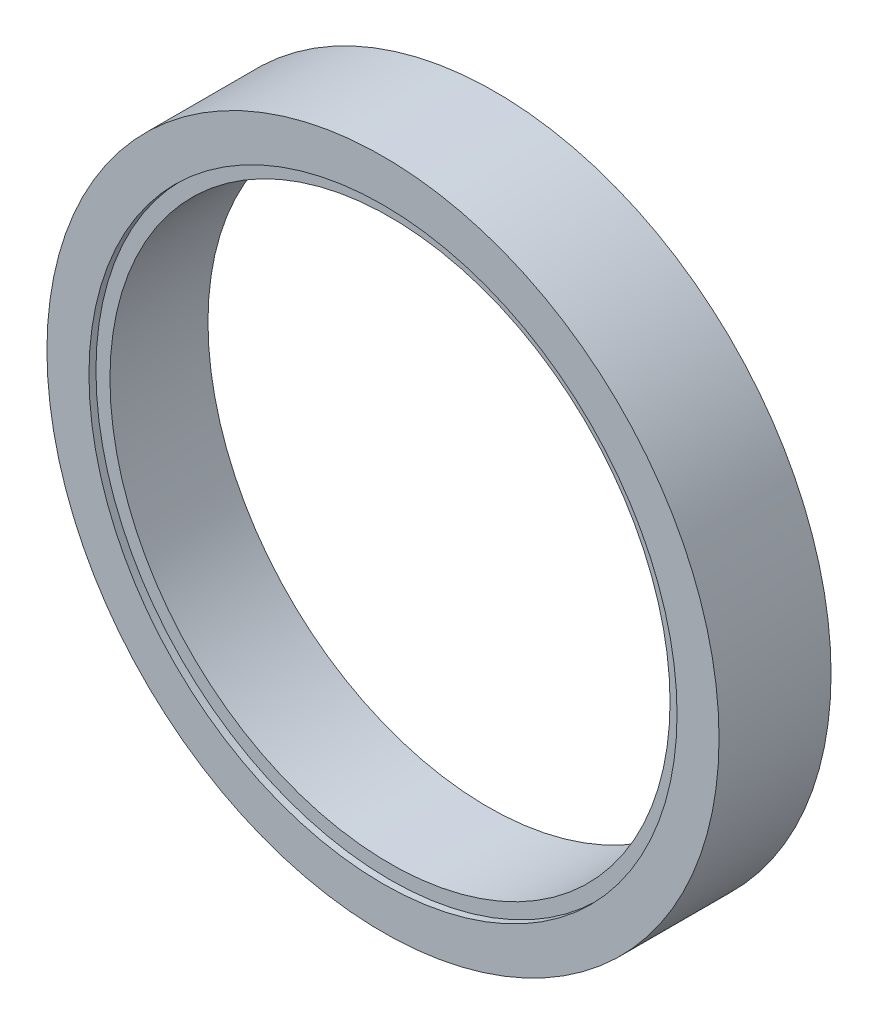
ISO-10303-21;
HEADER;
FILE_DESCRIPTION(('STEP AP214'),'2;1');
FILE_NAME('part.step','',(''),(''),'','','');
FILE_SCHEMA(('AUTOMOTIVE_DESIGN { 1 0 10303 214 1 1 1 1 }'));
ENDSEC;
DATA;
#1=APPLICATION_CONTEXT('core data for automotive mechanical design processes');
#2=APPLICATION_PROTOCOL_DEFINITION('international standard','automotive_design',2000,#1);
#3=PRODUCT_CONTEXT('',#1,'mechanical');
#4=PRODUCT('Part','Part','',(#3));
#5=PRODUCT_RELATED_PRODUCT_CATEGORY('part','',(#4));
#6=PRODUCT_DEFINITION_FORMATION('','',#4);
#7=PRODUCT_DEFINITION_CONTEXT('part definition',#1,'design');
#8=PRODUCT_DEFINITION('design','',#6,#7);
#9=PRODUCT_DEFINITION_SHAPE('','',#8);
#10=(LENGTH_UNIT() NAMED_UNIT(*) SI_UNIT(.MILLI.,.METRE.));
#11=(NAMED_UNIT(*) PLANE_ANGLE_UNIT() SI_UNIT($,.RADIAN.));
#12=(NAMED_UNIT(*) SI_UNIT($,.STERADIAN.) SOLID_ANGLE_UNIT());
#13=UNCERTAINTY_MEASURE_WITH_UNIT(LENGTH_MEASURE(1.E-05),#10,'distance_accuracy_value','');
#14=(GEOMETRIC_REPRESENTATION_CONTEXT(3) GLOBAL_UNCERTAINTY_ASSIGNED_CONTEXT((#13)) GLOBAL_UNIT_ASSIGNED_CONTEXT((#10,
#11,#12)) REPRESENTATION_CONTEXT('',''));
#15=CARTESIAN_POINT('',(0.,0.,0.));
#16=DIRECTION('',(0.,0.,1.));
#17=DIRECTION('',(1.,0.,0.));
#18=AXIS2_PLACEMENT_3D('',#15,#16,#17);
#19=CARTESIAN_POINT('',(0.,0.,12.7));
#20=DIRECTION('',(0.,0.,-1.));
#21=DIRECTION('',(-1.,0.,0.));
#22=AXIS2_PLACEMENT_3D('',#19,#20,#21);
#23=CYLINDRICAL_SURFACE('',#22,63.5);
#24=CARTESIAN_POINT('',(0.,0.,11.1125));
#25=DIRECTION('',(0.,0.,1.));
#26=DIRECTION('',(1.,0.,0.));
#27=AXIS2_PLACEMENT_3D('',#24,#25,#26);
#28=CIRCLE('',#27,63.5);
#29=CARTESIAN_POINT('',(63.5,0.,11.1125));
#30=VERTEX_POINT('',#29);
#31=EDGE_CURVE('E44',#30,#30,#28,.T.);
#32=ORIENTED_EDGE('',*,*,#31,.T.);
#33=EDGE_LOOP('',(#32));
#34=FACE_BOUND('',#33,.T.);
#35=CARTESIAN_POINT('',(0.,0.,-11.1125));
#36=DIRECTION('',(0.,0.,-1.));
#37=DIRECTION('',(-1.,0.,0.));
#38=AXIS2_PLACEMENT_3D('',#35,#36,#37);
#39=CIRCLE('',#38,63.5);
#40=CARTESIAN_POINT('',(-63.5,0.,-11.1125));
#41=VERTEX_POINT('',#40);
#42=EDGE_CURVE('E35',#41,#41,#39,.T.);
#43=ORIENTED_EDGE('',*,*,#42,.T.);
#44=EDGE_LOOP('',(#43));
#45=FACE_BOUND('',#44,.T.);
#46=ADVANCED_FACE('F31',(#34,#45),#23,.F.);
#47=CARTESIAN_POINT('',(0.,0.,12.7));
#48=DIRECTION('',(0.,0.,1.));
#49=DIRECTION('',(1.,0.,0.));
#50=AXIS2_PLACEMENT_3D('',#47,#48,#49);
#51=PLANE('',#50);
#52=CARTESIAN_POINT('',(0.,0.,12.7));
#53=DIRECTION('',(0.,0.,1.));
#54=DIRECTION('',(1.,0.,0.));
#55=AXIS2_PLACEMENT_3D('',#52,#53,#54);
#56=CIRCLE('',#55,66.675);
#57=CARTESIAN_POINT('',(66.675,0.,12.7));
#58=VERTEX_POINT('',#57);
#59=EDGE_CURVE('E47',#58,#58,#56,.T.);
#60=ORIENTED_EDGE('',*,*,#59,.F.);
#61=EDGE_LOOP('',(#60));
#62=FACE_BOUND('',#61,.T.);
#63=CARTESIAN_POINT('',(0.,0.,12.7));
#64=DIRECTION('',(0.,0.,1.));
#65=DIRECTION('',(1.,0.,0.));
#66=AXIS2_PLACEMENT_3D('',#63,#64,#65);
#67=CIRCLE('',#66,76.2);
#68=CARTESIAN_POINT('',(76.2,0.,12.7));
#69=VERTEX_POINT('',#68);
#70=EDGE_CURVE('E10',#69,#69,#67,.T.);
#71=ORIENTED_EDGE('',*,*,#70,.T.);
#72=EDGE_LOOP('',(#71));
#73=FACE_BOUND('',#72,.T.);
#74=ADVANCED_FACE('F80',(#62,#73),#51,.T.);
#75=CARTESIAN_POINT('',(0.,0.,-12.7));
#76=DIRECTION('',(0.,0.,1.));
#77=DIRECTION('',(1.,0.,0.));
#78=AXIS2_PLACEMENT_3D('',#75,#76,#77);
#79=PLANE('',#78);
#80=CARTESIAN_POINT('',(0.,0.,-12.7));
#81=DIRECTION('',(0.,0.,-1.));
#82=DIRECTION('',(-1.,0.,0.));
#83=AXIS2_PLACEMENT_3D('',#80,#81,#82);
#84=CIRCLE('',#83,69.85);
#85=CARTESIAN_POINT('',(-69.85,0.,-12.7));
#86=VERTEX_POINT('',#85);
#87=EDGE_CURVE('E58',#86,#86,#84,.T.);
#88=ORIENTED_EDGE('',*,*,#87,.F.);
#89=EDGE_LOOP('',(#88));
#90=FACE_BOUND('',#89,.T.);
#91=CARTESIAN_POINT('',(0.,0.,-12.7));
#92=DIRECTION('',(0.,0.,1.));
#93=DIRECTION('',(1.,0.,0.));
#94=AXIS2_PLACEMENT_3D('',#91,#92,#93);
#95=CIRCLE('',#94,76.2);
#96=CARTESIAN_POINT('',(76.2,0.,-12.7));
#97=VERTEX_POINT('',#96);
#98=EDGE_CURVE('E39',#97,#97,#95,.T.);
#99=ORIENTED_EDGE('',*,*,#98,.F.);
#100=EDGE_LOOP('',(#99));
#101=FACE_BOUND('',#100,.T.);
#102=ADVANCED_FACE('F85',(#90,#101),#79,.F.);
#103=CARTESIAN_POINT('',(0.,0.,12.7));
#104=DIRECTION('',(0.,0.,-1.));
#105=DIRECTION('',(-1.,0.,0.));
#106=AXIS2_PLACEMENT_3D('',#103,#104,#105);
#107=CYLINDRICAL_SURFACE('',#106,76.2);
#108=ORIENTED_EDGE('',*,*,#70,.F.);
#109=EDGE_LOOP('',(#108));
#110=FACE_BOUND('',#109,.T.);
#111=ORIENTED_EDGE('',*,*,#98,.T.);
#112=EDGE_LOOP('',(#111));
#113=FACE_BOUND('',#112,.T.);
#114=ADVANCED_FACE('F33',(#110,#113),#107,.T.);
#115=CARTESIAN_POINT('',(0.,0.,11.1125));
#116=DIRECTION('',(0.,0.,1.));
#117=DIRECTION('',(1.,0.,0.));
#118=AXIS2_PLACEMENT_3D('',#115,#116,#117);
#119=CYLINDRICAL_SURFACE('',#118,66.675);
#120=CARTESIAN_POINT('',(0.,0.,11.1125));
#121=DIRECTION('',(0.,0.,1.));
#122=DIRECTION('',(1.,0.,0.));
#123=AXIS2_PLACEMENT_3D('',#120,#121,#122);
#124=CIRCLE('',#123,66.675);
#125=CARTESIAN_POINT('',(66.675,0.,11.1125));
#126=VERTEX_POINT('',#125);
#127=EDGE_CURVE('E50',#126,#126,#124,.T.);
#128=ORIENTED_EDGE('',*,*,#127,.F.);
#129=EDGE_LOOP('',(#128));
#130=FACE_BOUND('',#129,.T.);
#131=ORIENTED_EDGE('',*,*,#59,.T.);
#132=EDGE_LOOP('',(#131));
#133=FACE_BOUND('',#132,.T.);
#134=ADVANCED_FACE('F89',(#130,#133),#119,.F.);
#135=CARTESIAN_POINT('',(0.,0.,11.1125));
#136=DIRECTION('',(0.,0.,1.));
#137=DIRECTION('',(1.,0.,0.));
#138=AXIS2_PLACEMENT_3D('',#135,#136,#137);
#139=PLANE('',#138);
#140=ORIENTED_EDGE('',*,*,#31,.F.);
#141=EDGE_LOOP('',(#140));
#142=FACE_BOUND('',#141,.T.);
#143=ORIENTED_EDGE('',*,*,#127,.T.);
#144=EDGE_LOOP('',(#143));
#145=FACE_BOUND('',#144,.T.);
#146=ADVANCED_FACE('F76',(#142,#145),#139,.T.);
#147=CARTESIAN_POINT('',(0.,0.,-11.1125));
#148=DIRECTION('',(0.,0.,-1.));
#149=DIRECTION('',(-1.,0.,0.));
#150=AXIS2_PLACEMENT_3D('',#147,#148,#149);
#151=CYLINDRICAL_SURFACE('',#150,69.85);
#152=CARTESIAN_POINT('',(0.,0.,-11.1125));
#153=DIRECTION('',(0.,0.,-1.));
#154=DIRECTION('',(-1.,0.,0.));
#155=AXIS2_PLACEMENT_3D('',#152,#153,#154);
#156=CIRCLE('',#155,69.85);
#157=CARTESIAN_POINT('',(-69.85,0.,-11.1125));
#158=VERTEX_POINT('',#157);
#159=EDGE_CURVE('E61',#158,#158,#156,.T.);
#160=ORIENTED_EDGE('',*,*,#159,.F.);
#161=EDGE_LOOP('',(#160));
#162=FACE_BOUND('',#161,.T.);
#163=ORIENTED_EDGE('',*,*,#87,.T.);
#164=EDGE_LOOP('',(#163));
#165=FACE_BOUND('',#164,.T.);
#166=ADVANCED_FACE('F71',(#162,#165),#151,.F.);
#167=CARTESIAN_POINT('',(0.,0.,-11.1125));
#168=DIRECTION('',(0.,0.,-1.));
#169=DIRECTION('',(-1.,0.,0.));
#170=AXIS2_PLACEMENT_3D('',#167,#168,#169);
#171=PLANE('',#170);
#172=ORIENTED_EDGE('',*,*,#42,.F.);
#173=EDGE_LOOP('',(#172));
#174=FACE_BOUND('',#173,.T.);
#175=ORIENTED_EDGE('',*,*,#159,.T.);
#176=EDGE_LOOP('',(#175));
#177=FACE_BOUND('',#176,.T.);
#178=ADVANCED_FACE('F69',(#174,#177),#171,.T.);
#179=CLOSED_SHELL('',(#46,#74,#102,#114,#134,#146,#166,#178));
#180=MANIFOLD_SOLID_BREP('B2',#179);
#181=ADVANCED_BREP_SHAPE_REPRESENTATION('',(#18,#180),#14);
#182=SHAPE_DEFINITION_REPRESENTATION(#9,#181);
ENDSEC;
END-ISO-10303-21;
